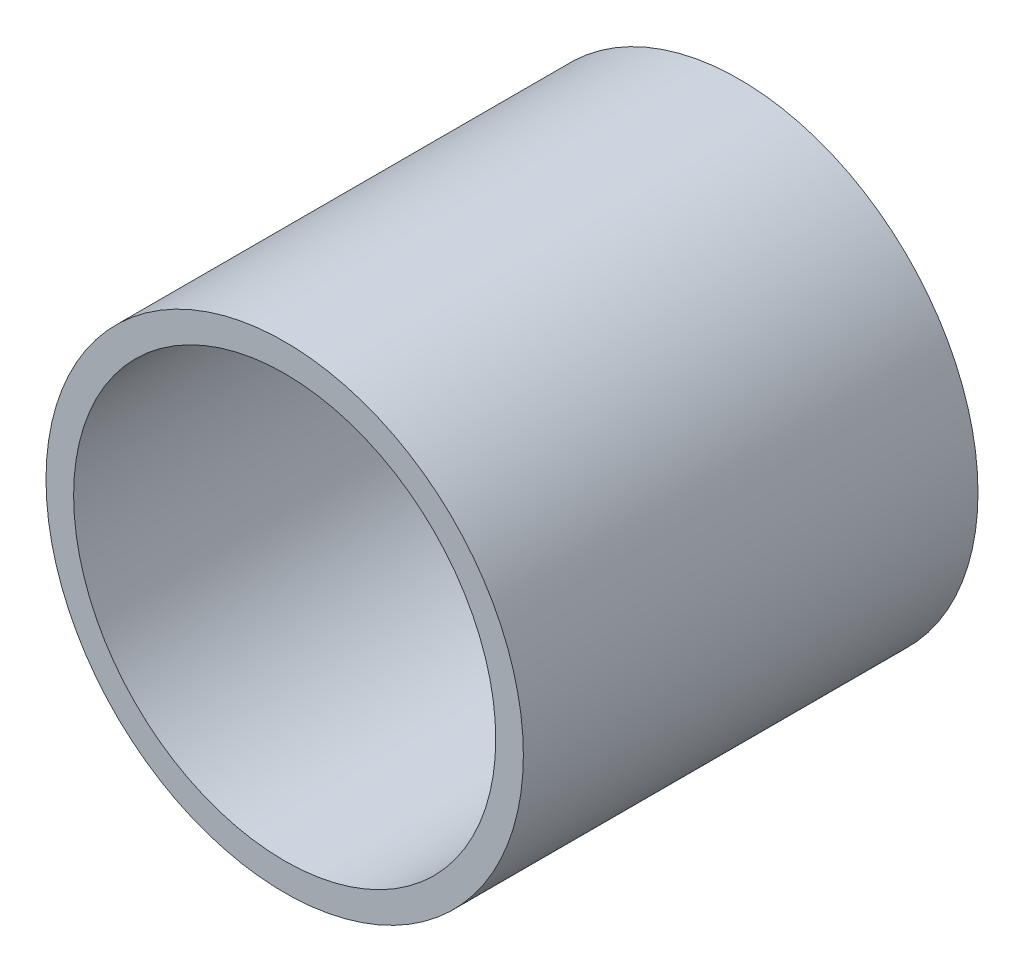
ISO-10303-21;
HEADER;
FILE_DESCRIPTION(('STEP AP214'),'2;1');
FILE_NAME('part.step','',(''),(''),'','','');
FILE_SCHEMA(('AUTOMOTIVE_DESIGN { 1 0 10303 214 1 1 1 1 }'));
ENDSEC;
DATA;
#1=APPLICATION_CONTEXT('core data for automotive mechanical design processes');
#2=APPLICATION_PROTOCOL_DEFINITION('international standard','automotive_design',2000,#1);
#3=PRODUCT_CONTEXT('',#1,'mechanical');
#4=PRODUCT('Part','Part','',(#3));
#5=PRODUCT_RELATED_PRODUCT_CATEGORY('part','',(#4));
#6=PRODUCT_DEFINITION_FORMATION('','',#4);
#7=PRODUCT_DEFINITION_CONTEXT('part definition',#1,'design');
#8=PRODUCT_DEFINITION('design','',#6,#7);
#9=PRODUCT_DEFINITION_SHAPE('','',#8);
#10=(LENGTH_UNIT() NAMED_UNIT(*) SI_UNIT(.MILLI.,.METRE.));
#11=(NAMED_UNIT(*) PLANE_ANGLE_UNIT() SI_UNIT($,.RADIAN.));
#12=(NAMED_UNIT(*) SI_UNIT($,.STERADIAN.) SOLID_ANGLE_UNIT());
#13=UNCERTAINTY_MEASURE_WITH_UNIT(LENGTH_MEASURE(1.E-05),#10,'distance_accuracy_value','');
#14=(GEOMETRIC_REPRESENTATION_CONTEXT(3) GLOBAL_UNCERTAINTY_ASSIGNED_CONTEXT((#13)) GLOBAL_UNIT_ASSIGNED_CONTEXT((#10,
#11,#12)) REPRESENTATION_CONTEXT('',''));
#15=CARTESIAN_POINT('',(0.,0.,0.));
#16=DIRECTION('',(0.,0.,1.));
#17=DIRECTION('',(1.,0.,0.));
#18=AXIS2_PLACEMENT_3D('',#15,#16,#17);
#19=CARTESIAN_POINT('',(0.,0.,4.));
#20=DIRECTION('',(0.,0.,1.));
#21=DIRECTION('',(1.,0.,0.));
#22=AXIS2_PLACEMENT_3D('',#19,#20,#21);
#23=PLANE('',#22);
#24=CARTESIAN_POINT('',(0.,0.,4.));
#25=DIRECTION('',(0.,0.,1.));
#26=DIRECTION('',(1.,0.,0.));
#27=AXIS2_PLACEMENT_3D('',#24,#25,#26);
#28=CIRCLE('',#27,2.1);
#29=CARTESIAN_POINT('',(2.1,0.,4.));
#30=VERTEX_POINT('',#29);
#31=EDGE_CURVE('E10',#30,#30,#28,.T.);
#32=ORIENTED_EDGE('',*,*,#31,.T.);
#33=EDGE_LOOP('',(#32));
#34=FACE_BOUND('',#33,.T.);
#35=CARTESIAN_POINT('',(0.,0.,4.));
#36=DIRECTION('',(0.,0.,1.));
#37=DIRECTION('',(1.,0.,0.));
#38=AXIS2_PLACEMENT_3D('',#35,#36,#37);
#39=CIRCLE('',#38,1.85701692249237);
#40=CARTESIAN_POINT('',(1.85701692249237,0.,4.));
#41=VERTEX_POINT('',#40);
#42=EDGE_CURVE('E48',#41,#41,#39,.T.);
#43=ORIENTED_EDGE('',*,*,#42,.F.);
#44=EDGE_LOOP('',(#43));
#45=FACE_BOUND('',#44,.T.);
#46=ADVANCED_FACE('F40',(#34,#45),#23,.T.);
#47=CARTESIAN_POINT('',(0.,0.,0.));
#48=DIRECTION('',(0.,0.,1.));
#49=DIRECTION('',(1.,0.,0.));
#50=AXIS2_PLACEMENT_3D('',#47,#48,#49);
#51=PLANE('',#50);
#52=CARTESIAN_POINT('',(0.,0.,0.));
#53=DIRECTION('',(0.,0.,1.));
#54=DIRECTION('',(1.,0.,0.));
#55=AXIS2_PLACEMENT_3D('',#52,#53,#54);
#56=CIRCLE('',#55,2.1);
#57=CARTESIAN_POINT('',(2.1,0.,0.));
#58=VERTEX_POINT('',#57);
#59=EDGE_CURVE('E41',#58,#58,#56,.T.);
#60=ORIENTED_EDGE('',*,*,#59,.F.);
#61=EDGE_LOOP('',(#60));
#62=FACE_BOUND('',#61,.T.);
#63=CARTESIAN_POINT('',(0.,0.,0.));
#64=DIRECTION('',(0.,0.,1.));
#65=DIRECTION('',(1.,0.,0.));
#66=AXIS2_PLACEMENT_3D('',#63,#64,#65);
#67=CIRCLE('',#66,1.85701692249237);
#68=CARTESIAN_POINT('',(1.85701692249237,0.,0.));
#69=VERTEX_POINT('',#68);
#70=EDGE_CURVE('E49',#69,#69,#67,.T.);
#71=ORIENTED_EDGE('',*,*,#70,.T.);
#72=EDGE_LOOP('',(#71));
#73=FACE_BOUND('',#72,.T.);
#74=ADVANCED_FACE('F58',(#62,#73),#51,.F.);
#75=CARTESIAN_POINT('',(0.,0.,4.));
#76=DIRECTION('',(0.,0.,-1.));
#77=DIRECTION('',(-1.,0.,0.));
#78=AXIS2_PLACEMENT_3D('',#75,#76,#77);
#79=CYLINDRICAL_SURFACE('',#78,2.1);
#80=ORIENTED_EDGE('',*,*,#31,.F.);
#81=EDGE_LOOP('',(#80));
#82=FACE_BOUND('',#81,.T.);
#83=ORIENTED_EDGE('',*,*,#59,.T.);
#84=EDGE_LOOP('',(#83));
#85=FACE_BOUND('',#84,.T.);
#86=ADVANCED_FACE('F39',(#82,#85),#79,.T.);
#87=CARTESIAN_POINT('',(0.,0.,4.));
#88=DIRECTION('',(0.,0.,-1.));
#89=DIRECTION('',(-1.,0.,0.));
#90=AXIS2_PLACEMENT_3D('',#87,#88,#89);
#91=CYLINDRICAL_SURFACE('',#90,1.85701692249237);
#92=ORIENTED_EDGE('',*,*,#42,.T.);
#93=EDGE_LOOP('',(#92));
#94=FACE_BOUND('',#93,.T.);
#95=ORIENTED_EDGE('',*,*,#70,.F.);
#96=EDGE_LOOP('',(#95));
#97=FACE_BOUND('',#96,.T.);
#98=ADVANCED_FACE('F57',(#94,#97),#91,.F.);
#99=CLOSED_SHELL('',(#46,#74,#86,#98));
#100=MANIFOLD_SOLID_BREP('B2',#99);
#101=ADVANCED_BREP_SHAPE_REPRESENTATION('',(#18,#100),#14);
#102=SHAPE_DEFINITION_REPRESENTATION(#9,#101);
ENDSEC;
END-ISO-10303-21;
